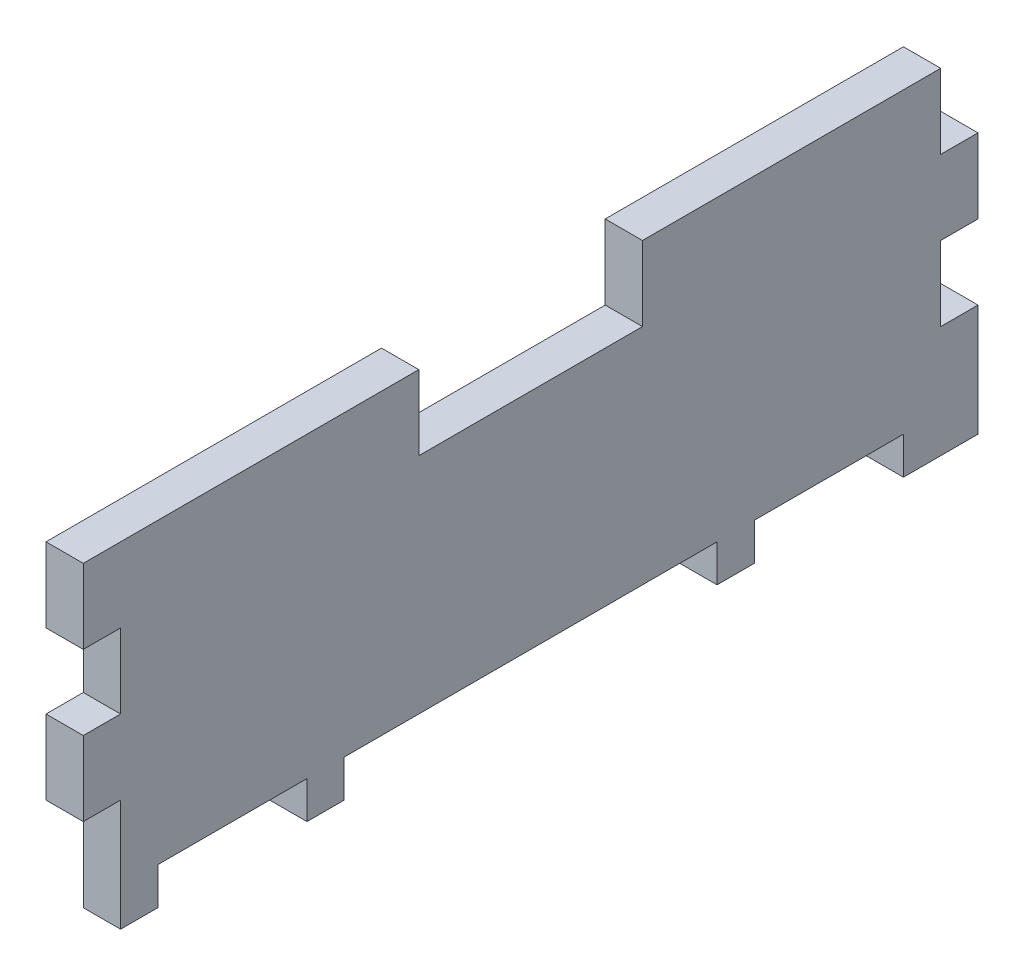
ISO-10303-21;
HEADER;
FILE_DESCRIPTION(('STEP AP214'),'2;1');
FILE_NAME('part.step','',(''),(''),'','','');
FILE_SCHEMA(('AUTOMOTIVE_DESIGN { 1 0 10303 214 1 1 1 1 }'));
ENDSEC;
DATA;
#1=APPLICATION_CONTEXT('core data for automotive mechanical design processes');
#2=APPLICATION_PROTOCOL_DEFINITION('international standard','automotive_design',2000,#1);
#3=PRODUCT_CONTEXT('',#1,'mechanical');
#4=PRODUCT('Part','Part','',(#3));
#5=PRODUCT_RELATED_PRODUCT_CATEGORY('part','',(#4));
#6=PRODUCT_DEFINITION_FORMATION('','',#4);
#7=PRODUCT_DEFINITION_CONTEXT('part definition',#1,'design');
#8=PRODUCT_DEFINITION('design','',#6,#7);
#9=PRODUCT_DEFINITION_SHAPE('','',#8);
#10=(LENGTH_UNIT() NAMED_UNIT(*) SI_UNIT(.MILLI.,.METRE.));
#11=(NAMED_UNIT(*) PLANE_ANGLE_UNIT() SI_UNIT($,.RADIAN.));
#12=(NAMED_UNIT(*) SI_UNIT($,.STERADIAN.) SOLID_ANGLE_UNIT());
#13=UNCERTAINTY_MEASURE_WITH_UNIT(LENGTH_MEASURE(1.E-05),#10,'distance_accuracy_value','');
#14=(GEOMETRIC_REPRESENTATION_CONTEXT(3) GLOBAL_UNCERTAINTY_ASSIGNED_CONTEXT((#13)) GLOBAL_UNIT_ASSIGNED_CONTEXT((#10,
#11,#12)) REPRESENTATION_CONTEXT('',''));
#15=CARTESIAN_POINT('',(0.,0.,0.));
#16=DIRECTION('',(0.,0.,1.));
#17=DIRECTION('',(1.,0.,0.));
#18=AXIS2_PLACEMENT_3D('',#15,#16,#17);
#19=CARTESIAN_POINT('',(6.35,25.4,0.));
#20=DIRECTION('',(0.,1.,0.));
#21=DIRECTION('',(0.,0.,1.));
#22=AXIS2_PLACEMENT_3D('',#19,#20,#21);
#23=PLANE('',#22);
#24=DIRECTION('',(0.,0.,-1.));
#25=VECTOR('',#24,1.);
#26=CARTESIAN_POINT('',(0.,25.4,0.));
#27=LINE('',#26,#25);
#28=CARTESIAN_POINT('',(0.,25.4,-19.05));
#29=VERTEX_POINT('',#28);
#30=CARTESIAN_POINT('',(0.,25.4,-69.85));
#31=VERTEX_POINT('',#30);
#32=EDGE_CURVE('E274',#29,#31,#27,.T.);
#33=ORIENTED_EDGE('',*,*,#32,.F.);
#34=DIRECTION('',(-1.,0.,0.));
#35=VECTOR('',#34,1.);
#36=CARTESIAN_POINT('',(6.35,25.4,-19.05));
#37=LINE('',#36,#35);
#38=CARTESIAN_POINT('',(6.35,25.4,-19.05));
#39=VERTEX_POINT('',#38);
#40=EDGE_CURVE('E11',#39,#29,#37,.T.);
#41=ORIENTED_EDGE('',*,*,#40,.F.);
#42=DIRECTION('',(0.,0.,-1.));
#43=VECTOR('',#42,1.);
#44=CARTESIAN_POINT('',(6.35,25.4,0.));
#45=LINE('',#44,#43);
#46=CARTESIAN_POINT('',(6.35,25.4,-69.85));
#47=VERTEX_POINT('',#46);
#48=EDGE_CURVE('E436',#39,#47,#45,.T.);
#49=ORIENTED_EDGE('',*,*,#48,.T.);
#50=DIRECTION('',(-1.,0.,0.));
#51=VECTOR('',#50,1.);
#52=CARTESIAN_POINT('',(6.35,25.4,-69.85));
#53=LINE('',#52,#51);
#54=EDGE_CURVE('E52',#47,#31,#53,.T.);
#55=ORIENTED_EDGE('',*,*,#54,.T.);
#56=EDGE_LOOP('',(#33,#41,#49,#55));
#57=FACE_BOUND('',#56,.T.);
#58=ADVANCED_FACE('F35',(#57),#23,.T.);
#59=CARTESIAN_POINT('',(6.35,0.,-19.05));
#60=DIRECTION('',(0.,0.,-1.));
#61=DIRECTION('',(0.,1.,0.));
#62=AXIS2_PLACEMENT_3D('',#59,#60,#61);
#63=PLANE('',#62);
#64=DIRECTION('',(0.,-1.,0.));
#65=VECTOR('',#64,1.);
#66=CARTESIAN_POINT('',(0.,0.,-19.05));
#67=LINE('',#66,#65);
#68=CARTESIAN_POINT('',(0.,12.7,-19.05));
#69=VERTEX_POINT('',#68);
#70=EDGE_CURVE('E276',#29,#69,#67,.T.);
#71=ORIENTED_EDGE('',*,*,#70,.T.);
#72=DIRECTION('',(-1.,0.,0.));
#73=VECTOR('',#72,1.);
#74=CARTESIAN_POINT('',(6.35,12.7,-19.05));
#75=LINE('',#74,#73);
#76=CARTESIAN_POINT('',(6.35,12.7,-19.05));
#77=VERTEX_POINT('',#76);
#78=EDGE_CURVE('E44',#77,#69,#75,.T.);
#79=ORIENTED_EDGE('',*,*,#78,.F.);
#80=DIRECTION('',(0.,-1.,0.));
#81=VECTOR('',#80,1.);
#82=CARTESIAN_POINT('',(6.35,0.,-19.05));
#83=LINE('',#82,#81);
#84=EDGE_CURVE('E432',#39,#77,#83,.T.);
#85=ORIENTED_EDGE('',*,*,#84,.F.);
#86=ORIENTED_EDGE('',*,*,#40,.T.);
#87=EDGE_LOOP('',(#71,#79,#85,#86));
#88=FACE_BOUND('',#87,.T.);
#89=ADVANCED_FACE('F37',(#88),#63,.F.);
#90=CARTESIAN_POINT('',(6.35,12.7,0.));
#91=DIRECTION('',(0.,1.,0.));
#92=DIRECTION('',(0.,0.,1.));
#93=AXIS2_PLACEMENT_3D('',#90,#91,#92);
#94=PLANE('',#93);
#95=DIRECTION('',(0.,0.,-1.));
#96=VECTOR('',#95,1.);
#97=CARTESIAN_POINT('',(0.,12.7,0.));
#98=LINE('',#97,#96);
#99=CARTESIAN_POINT('',(0.,12.7,19.05));
#100=VERTEX_POINT('',#99);
#101=EDGE_CURVE('E281',#100,#69,#98,.T.);
#102=ORIENTED_EDGE('',*,*,#101,.F.);
#103=DIRECTION('',(-1.,0.,0.));
#104=VECTOR('',#103,1.);
#105=CARTESIAN_POINT('',(6.35,12.7,19.05));
#106=LINE('',#105,#104);
#107=CARTESIAN_POINT('',(6.35,12.7,19.05));
#108=VERTEX_POINT('',#107);
#109=EDGE_CURVE('E408',#108,#100,#106,.T.);
#110=ORIENTED_EDGE('',*,*,#109,.F.);
#111=DIRECTION('',(0.,0.,-1.));
#112=VECTOR('',#111,1.);
#113=CARTESIAN_POINT('',(6.35,12.7,0.));
#114=LINE('',#113,#112);
#115=EDGE_CURVE('E415',#108,#77,#114,.T.);
#116=ORIENTED_EDGE('',*,*,#115,.T.);
#117=ORIENTED_EDGE('',*,*,#78,.T.);
#118=EDGE_LOOP('',(#102,#110,#116,#117));
#119=FACE_BOUND('',#118,.T.);
#120=ADVANCED_FACE('F413',(#119),#94,.T.);
#121=CARTESIAN_POINT('',(6.35,0.,19.05));
#122=DIRECTION('',(0.,0.,-1.));
#123=DIRECTION('',(-1.,0.,0.));
#124=AXIS2_PLACEMENT_3D('',#121,#122,#123);
#125=PLANE('',#124);
#126=DIRECTION('',(0.,-1.,0.));
#127=VECTOR('',#126,1.);
#128=CARTESIAN_POINT('',(0.,0.,19.05));
#129=LINE('',#128,#127);
#130=CARTESIAN_POINT('',(0.,25.4,19.05));
#131=VERTEX_POINT('',#130);
#132=EDGE_CURVE('E284',#131,#100,#129,.T.);
#133=ORIENTED_EDGE('',*,*,#132,.F.);
#134=DIRECTION('',(-1.,0.,0.));
#135=VECTOR('',#134,1.);
#136=CARTESIAN_POINT('',(6.35,25.4,19.05));
#137=LINE('',#136,#135);
#138=CARTESIAN_POINT('',(6.35,25.4,19.05));
#139=VERTEX_POINT('',#138);
#140=EDGE_CURVE('E406',#139,#131,#137,.T.);
#141=ORIENTED_EDGE('',*,*,#140,.F.);
#142=DIRECTION('',(0.,-1.,0.));
#143=VECTOR('',#142,1.);
#144=CARTESIAN_POINT('',(6.35,0.,19.05));
#145=LINE('',#144,#143);
#146=EDGE_CURVE('E428',#139,#108,#145,.T.);
#147=ORIENTED_EDGE('',*,*,#146,.T.);
#148=ORIENTED_EDGE('',*,*,#109,.T.);
#149=EDGE_LOOP('',(#133,#141,#147,#148));
#150=FACE_BOUND('',#149,.T.);
#151=ADVANCED_FACE('F425',(#150),#125,.T.);
#152=CARTESIAN_POINT('',(0.,25.4,76.2));
#153=VERTEX_POINT('',#152);
#154=EDGE_CURVE('E278',#153,#131,#27,.T.);
#155=ORIENTED_EDGE('',*,*,#154,.F.);
#156=DIRECTION('',(-1.,0.,0.));
#157=VECTOR('',#156,1.);
#158=CARTESIAN_POINT('',(6.35,25.4,76.2));
#159=LINE('',#158,#157);
#160=CARTESIAN_POINT('',(6.35,25.4,76.2));
#161=VERTEX_POINT('',#160);
#162=EDGE_CURVE('E404',#161,#153,#159,.T.);
#163=ORIENTED_EDGE('',*,*,#162,.F.);
#164=EDGE_CURVE('E434',#161,#139,#45,.T.);
#165=ORIENTED_EDGE('',*,*,#164,.T.);
#166=ORIENTED_EDGE('',*,*,#140,.T.);
#167=EDGE_LOOP('',(#155,#163,#165,#166));
#168=FACE_BOUND('',#167,.T.);
#169=ADVANCED_FACE('F512',(#168),#23,.T.);
#170=CARTESIAN_POINT('',(6.35,0.,76.2));
#171=DIRECTION('',(0.,0.,1.));
#172=DIRECTION('',(1.,0.,0.));
#173=AXIS2_PLACEMENT_3D('',#170,#171,#172);
#174=PLANE('',#173);
#175=DIRECTION('',(0.,1.,0.));
#176=VECTOR('',#175,1.);
#177=CARTESIAN_POINT('',(0.,0.,76.2));
#178=LINE('',#177,#176);
#179=CARTESIAN_POINT('',(0.,12.7,76.2));
#180=VERTEX_POINT('',#179);
#181=EDGE_CURVE('E287',#180,#153,#178,.T.);
#182=ORIENTED_EDGE('',*,*,#181,.F.);
#183=DIRECTION('',(-1.,0.,0.));
#184=VECTOR('',#183,1.);
#185=CARTESIAN_POINT('',(6.35,12.7,76.2));
#186=LINE('',#185,#184);
#187=CARTESIAN_POINT('',(6.35,12.7,76.2));
#188=VERTEX_POINT('',#187);
#189=EDGE_CURVE('E402',#188,#180,#186,.T.);
#190=ORIENTED_EDGE('',*,*,#189,.F.);
#191=DIRECTION('',(0.,1.,0.));
#192=VECTOR('',#191,1.);
#193=CARTESIAN_POINT('',(6.35,0.,76.2));
#194=LINE('',#193,#192);
#195=EDGE_CURVE('E440',#188,#161,#194,.T.);
#196=ORIENTED_EDGE('',*,*,#195,.T.);
#197=ORIENTED_EDGE('',*,*,#162,.T.);
#198=EDGE_LOOP('',(#182,#190,#196,#197));
#199=FACE_BOUND('',#198,.T.);
#200=ADVANCED_FACE('F519',(#199),#174,.T.);
#201=CARTESIAN_POINT('',(6.35,12.7,0.));
#202=DIRECTION('',(0.,1.,0.));
#203=DIRECTION('',(0.,0.,1.));
#204=AXIS2_PLACEMENT_3D('',#201,#202,#203);
#205=PLANE('',#204);
#206=DIRECTION('',(0.,0.,-1.));
#207=VECTOR('',#206,1.);
#208=CARTESIAN_POINT('',(0.,12.7,0.));
#209=LINE('',#208,#207);
#210=CARTESIAN_POINT('',(0.,12.7,69.85));
#211=VERTEX_POINT('',#210);
#212=EDGE_CURVE('E290',#180,#211,#209,.T.);
#213=ORIENTED_EDGE('',*,*,#212,.T.);
#214=DIRECTION('',(-1.,0.,0.));
#215=VECTOR('',#214,1.);
#216=CARTESIAN_POINT('',(6.35,12.7,69.85));
#217=LINE('',#216,#215);
#218=CARTESIAN_POINT('',(6.35,12.7,69.85));
#219=VERTEX_POINT('',#218);
#220=EDGE_CURVE('E399',#219,#211,#217,.T.);
#221=ORIENTED_EDGE('',*,*,#220,.F.);
#222=DIRECTION('',(0.,0.,-1.));
#223=VECTOR('',#222,1.);
#224=CARTESIAN_POINT('',(6.35,12.7,0.));
#225=LINE('',#224,#223);
#226=EDGE_CURVE('E443',#188,#219,#225,.T.);
#227=ORIENTED_EDGE('',*,*,#226,.F.);
#228=ORIENTED_EDGE('',*,*,#189,.T.);
#229=EDGE_LOOP('',(#213,#221,#227,#228));
#230=FACE_BOUND('',#229,.T.);
#231=ADVANCED_FACE('F525',(#230),#205,.F.);
#232=CARTESIAN_POINT('',(6.35,0.,69.85));
#233=DIRECTION('',(0.,0.,-1.));
#234=DIRECTION('',(-1.,0.,0.));
#235=AXIS2_PLACEMENT_3D('',#232,#233,#234);
#236=PLANE('',#235);
#237=DIRECTION('',(0.,-1.,0.));
#238=VECTOR('',#237,1.);
#239=CARTESIAN_POINT('',(0.,0.,69.85));
#240=LINE('',#239,#238);
#241=CARTESIAN_POINT('',(0.,0.,69.85));
#242=VERTEX_POINT('',#241);
#243=EDGE_CURVE('E293',#211,#242,#240,.T.);
#244=ORIENTED_EDGE('',*,*,#243,.T.);
#245=DIRECTION('',(-1.,0.,0.));
#246=VECTOR('',#245,1.);
#247=CARTESIAN_POINT('',(6.35,0.,69.85));
#248=LINE('',#247,#246);
#249=CARTESIAN_POINT('',(6.35,0.,69.85));
#250=VERTEX_POINT('',#249);
#251=EDGE_CURVE('E396',#250,#242,#248,.T.);
#252=ORIENTED_EDGE('',*,*,#251,.F.);
#253=DIRECTION('',(0.,-1.,0.));
#254=VECTOR('',#253,1.);
#255=CARTESIAN_POINT('',(6.35,0.,69.85));
#256=LINE('',#255,#254);
#257=EDGE_CURVE('E446',#219,#250,#256,.T.);
#258=ORIENTED_EDGE('',*,*,#257,.F.);
#259=ORIENTED_EDGE('',*,*,#220,.T.);
#260=EDGE_LOOP('',(#244,#252,#258,#259));
#261=FACE_BOUND('',#260,.T.);
#262=ADVANCED_FACE('F779',(#261),#236,.F.);
#263=CARTESIAN_POINT('',(6.35,0.,0.));
#264=DIRECTION('',(0.,-1.,0.));
#265=DIRECTION('',(0.,0.,-1.));
#266=AXIS2_PLACEMENT_3D('',#263,#264,#265);
#267=PLANE('',#266);
#268=DIRECTION('',(0.,0.,1.));
#269=VECTOR('',#268,1.);
#270=CARTESIAN_POINT('',(0.,0.,0.));
#271=LINE('',#270,#269);
#272=CARTESIAN_POINT('',(0.,0.,76.2));
#273=VERTEX_POINT('',#272);
#274=EDGE_CURVE('E295',#242,#273,#271,.T.);
#275=ORIENTED_EDGE('',*,*,#274,.T.);
#276=DIRECTION('',(-1.,0.,0.));
#277=VECTOR('',#276,1.);
#278=CARTESIAN_POINT('',(6.35,0.,76.2));
#279=LINE('',#278,#277);
#280=CARTESIAN_POINT('',(6.35,0.,76.2));
#281=VERTEX_POINT('',#280);
#282=EDGE_CURVE('E394',#281,#273,#279,.T.);
#283=ORIENTED_EDGE('',*,*,#282,.F.);
#284=DIRECTION('',(0.,0.,1.));
#285=VECTOR('',#284,1.);
#286=CARTESIAN_POINT('',(6.35,0.,0.));
#287=LINE('',#286,#285);
#288=EDGE_CURVE('E448',#250,#281,#287,.T.);
#289=ORIENTED_EDGE('',*,*,#288,.F.);
#290=ORIENTED_EDGE('',*,*,#251,.T.);
#291=EDGE_LOOP('',(#275,#283,#289,#290));
#292=FACE_BOUND('',#291,.T.);
#293=ADVANCED_FACE('F769',(#292),#267,.F.);
#294=CARTESIAN_POINT('',(0.,-12.7,76.2));
#295=VERTEX_POINT('',#294);
#296=EDGE_CURVE('E291',#295,#273,#178,.T.);
#297=ORIENTED_EDGE('',*,*,#296,.F.);
#298=DIRECTION('',(-1.,0.,0.));
#299=VECTOR('',#298,1.);
#300=CARTESIAN_POINT('',(6.35,-12.7,76.2));
#301=LINE('',#300,#299);
#302=CARTESIAN_POINT('',(6.35,-12.7,76.2));
#303=VERTEX_POINT('',#302);
#304=EDGE_CURVE('E392',#303,#295,#301,.T.);
#305=ORIENTED_EDGE('',*,*,#304,.F.);
#306=EDGE_CURVE('E444',#303,#281,#194,.T.);
#307=ORIENTED_EDGE('',*,*,#306,.T.);
#308=ORIENTED_EDGE('',*,*,#282,.T.);
#309=EDGE_LOOP('',(#297,#305,#307,#308));
#310=FACE_BOUND('',#309,.T.);
#311=ADVANCED_FACE('F528',(#310),#174,.T.);
#312=CARTESIAN_POINT('',(6.35,-12.7,0.));
#313=DIRECTION('',(0.,1.,0.));
#314=DIRECTION('',(0.,0.,1.));
#315=AXIS2_PLACEMENT_3D('',#312,#313,#314);
#316=PLANE('',#315);
#317=DIRECTION('',(0.,0.,-1.));
#318=VECTOR('',#317,1.);
#319=CARTESIAN_POINT('',(0.,-12.7,0.));
#320=LINE('',#319,#318);
#321=CARTESIAN_POINT('',(0.,-12.7,69.85));
#322=VERTEX_POINT('',#321);
#323=EDGE_CURVE('E298',#295,#322,#320,.T.);
#324=ORIENTED_EDGE('',*,*,#323,.T.);
#325=DIRECTION('',(-1.,0.,0.));
#326=VECTOR('',#325,1.);
#327=CARTESIAN_POINT('',(6.35,-12.7,69.85));
#328=LINE('',#327,#326);
#329=CARTESIAN_POINT('',(6.35,-12.7,69.85));
#330=VERTEX_POINT('',#329);
#331=EDGE_CURVE('E389',#330,#322,#328,.T.);
#332=ORIENTED_EDGE('',*,*,#331,.F.);
#333=DIRECTION('',(0.,0.,-1.));
#334=VECTOR('',#333,1.);
#335=CARTESIAN_POINT('',(6.35,-12.7,0.));
#336=LINE('',#335,#334);
#337=EDGE_CURVE('E450',#303,#330,#336,.T.);
#338=ORIENTED_EDGE('',*,*,#337,.F.);
#339=ORIENTED_EDGE('',*,*,#304,.T.);
#340=EDGE_LOOP('',(#324,#332,#338,#339));
#341=FACE_BOUND('',#340,.T.);
#342=ADVANCED_FACE('F748',(#341),#316,.F.);
#343=CARTESIAN_POINT('',(6.35,0.,69.85));
#344=DIRECTION('',(0.,0.,-1.));
#345=DIRECTION('',(0.,1.,0.));
#346=AXIS2_PLACEMENT_3D('',#343,#344,#345);
#347=PLANE('',#346);
#348=DIRECTION('',(0.,-1.,0.));
#349=VECTOR('',#348,1.);
#350=CARTESIAN_POINT('',(0.,0.,69.85));
#351=LINE('',#350,#349);
#352=CARTESIAN_POINT('',(0.,-31.75,69.85));
#353=VERTEX_POINT('',#352);
#354=EDGE_CURVE('E300',#322,#353,#351,.T.);
#355=ORIENTED_EDGE('',*,*,#354,.T.);
#356=DIRECTION('',(-1.,0.,0.));
#357=VECTOR('',#356,1.);
#358=CARTESIAN_POINT('',(6.35,-31.75,69.85));
#359=LINE('',#358,#357);
#360=CARTESIAN_POINT('',(6.35,-31.75,69.85));
#361=VERTEX_POINT('',#360);
#362=EDGE_CURVE('E386',#361,#353,#359,.T.);
#363=ORIENTED_EDGE('',*,*,#362,.F.);
#364=DIRECTION('',(0.,-1.,0.));
#365=VECTOR('',#364,1.);
#366=CARTESIAN_POINT('',(6.35,0.,69.85));
#367=LINE('',#366,#365);
#368=EDGE_CURVE('E452',#330,#361,#367,.T.);
#369=ORIENTED_EDGE('',*,*,#368,.F.);
#370=ORIENTED_EDGE('',*,*,#331,.T.);
#371=EDGE_LOOP('',(#355,#363,#369,#370));
#372=FACE_BOUND('',#371,.T.);
#373=ADVANCED_FACE('F738',(#372),#347,.F.);
#374=CARTESIAN_POINT('',(6.35,-31.75,0.));
#375=DIRECTION('',(0.,1.,0.));
#376=DIRECTION('',(0.,0.,1.));
#377=AXIS2_PLACEMENT_3D('',#374,#375,#376);
#378=PLANE('',#377);
#379=DIRECTION('',(0.,0.,-1.));
#380=VECTOR('',#379,1.);
#381=CARTESIAN_POINT('',(0.,-31.75,0.));
#382=LINE('',#381,#380);
#383=CARTESIAN_POINT('',(0.,-31.75,63.5));
#384=VERTEX_POINT('',#383);
#385=EDGE_CURVE('E302',#353,#384,#382,.T.);
#386=ORIENTED_EDGE('',*,*,#385,.T.);
#387=DIRECTION('',(-1.,0.,0.));
#388=VECTOR('',#387,1.);
#389=CARTESIAN_POINT('',(6.35,-31.75,63.5));
#390=LINE('',#389,#388);
#391=CARTESIAN_POINT('',(6.35,-31.75,63.5));
#392=VERTEX_POINT('',#391);
#393=EDGE_CURVE('E384',#392,#384,#390,.T.);
#394=ORIENTED_EDGE('',*,*,#393,.F.);
#395=DIRECTION('',(0.,0.,-1.));
#396=VECTOR('',#395,1.);
#397=CARTESIAN_POINT('',(6.35,-31.75,0.));
#398=LINE('',#397,#396);
#399=EDGE_CURVE('E454',#361,#392,#398,.T.);
#400=ORIENTED_EDGE('',*,*,#399,.F.);
#401=ORIENTED_EDGE('',*,*,#362,.T.);
#402=EDGE_LOOP('',(#386,#394,#400,#401));
#403=FACE_BOUND('',#402,.T.);
#404=ADVANCED_FACE('F727',(#403),#378,.F.);
#405=CARTESIAN_POINT('',(6.35,0.,63.5));
#406=DIRECTION('',(0.,0.,-1.));
#407=DIRECTION('',(-1.,0.,0.));
#408=AXIS2_PLACEMENT_3D('',#405,#406,#407);
#409=PLANE('',#408);
#410=DIRECTION('',(0.,-1.,0.));
#411=VECTOR('',#410,1.);
#412=CARTESIAN_POINT('',(0.,0.,63.5));
#413=LINE('',#412,#411);
#414=CARTESIAN_POINT('',(0.,-25.4,63.5));
#415=VERTEX_POINT('',#414);
#416=EDGE_CURVE('E305',#415,#384,#413,.T.);
#417=ORIENTED_EDGE('',*,*,#416,.F.);
#418=DIRECTION('',(-1.,0.,0.));
#419=VECTOR('',#418,1.);
#420=CARTESIAN_POINT('',(6.35,-25.4,63.5));
#421=LINE('',#420,#419);
#422=CARTESIAN_POINT('',(6.35,-25.4,63.5));
#423=VERTEX_POINT('',#422);
#424=EDGE_CURVE('E382',#423,#415,#421,.T.);
#425=ORIENTED_EDGE('',*,*,#424,.F.);
#426=DIRECTION('',(0.,-1.,0.));
#427=VECTOR('',#426,1.);
#428=CARTESIAN_POINT('',(6.35,0.,63.5));
#429=LINE('',#428,#427);
#430=EDGE_CURVE('E456',#423,#392,#429,.T.);
#431=ORIENTED_EDGE('',*,*,#430,.T.);
#432=ORIENTED_EDGE('',*,*,#393,.T.);
#433=EDGE_LOOP('',(#417,#425,#431,#432));
#434=FACE_BOUND('',#433,.T.);
#435=ADVANCED_FACE('F717',(#434),#409,.T.);
#436=CARTESIAN_POINT('',(6.35,-25.4,0.));
#437=DIRECTION('',(0.,1.,0.));
#438=DIRECTION('',(0.,0.,1.));
#439=AXIS2_PLACEMENT_3D('',#436,#437,#438);
#440=PLANE('',#439);
#441=DIRECTION('',(0.,0.,-1.));
#442=VECTOR('',#441,1.);
#443=CARTESIAN_POINT('',(0.,-25.4,0.));
#444=LINE('',#443,#442);
#445=CARTESIAN_POINT('',(0.,-25.4,38.1));
#446=VERTEX_POINT('',#445);
#447=EDGE_CURVE('E308',#415,#446,#444,.T.);
#448=ORIENTED_EDGE('',*,*,#447,.T.);
#449=DIRECTION('',(-1.,0.,0.));
#450=VECTOR('',#449,1.);
#451=CARTESIAN_POINT('',(6.35,-25.4,38.1));
#452=LINE('',#451,#450);
#453=CARTESIAN_POINT('',(6.35,-25.4,38.1));
#454=VERTEX_POINT('',#453);
#455=EDGE_CURVE('E379',#454,#446,#452,.T.);
#456=ORIENTED_EDGE('',*,*,#455,.F.);
#457=DIRECTION('',(0.,0.,-1.));
#458=VECTOR('',#457,1.);
#459=CARTESIAN_POINT('',(6.35,-25.4,0.));
#460=LINE('',#459,#458);
#461=EDGE_CURVE('E459',#423,#454,#460,.T.);
#462=ORIENTED_EDGE('',*,*,#461,.F.);
#463=ORIENTED_EDGE('',*,*,#424,.T.);
#464=EDGE_LOOP('',(#448,#456,#462,#463));
#465=FACE_BOUND('',#464,.T.);
#466=ADVANCED_FACE('F637',(#465),#440,.F.);
#467=CARTESIAN_POINT('',(6.35,0.,38.1));
#468=DIRECTION('',(0.,0.,-1.));
#469=DIRECTION('',(0.,1.,0.));
#470=AXIS2_PLACEMENT_3D('',#467,#468,#469);
#471=PLANE('',#470);
#472=DIRECTION('',(0.,-1.,0.));
#473=VECTOR('',#472,1.);
#474=CARTESIAN_POINT('',(0.,0.,38.1));
#475=LINE('',#474,#473);
#476=CARTESIAN_POINT('',(0.,-31.7499999999999,38.1));
#477=VERTEX_POINT('',#476);
#478=EDGE_CURVE('E310',#446,#477,#475,.T.);
#479=ORIENTED_EDGE('',*,*,#478,.T.);
#480=DIRECTION('',(-1.,0.,0.));
#481=VECTOR('',#480,1.);
#482=CARTESIAN_POINT('',(6.35,-31.7499999999999,38.1));
#483=LINE('',#482,#481);
#484=CARTESIAN_POINT('',(6.35,-31.7499999999999,38.1));
#485=VERTEX_POINT('',#484);
#486=EDGE_CURVE('E376',#485,#477,#483,.T.);
#487=ORIENTED_EDGE('',*,*,#486,.F.);
#488=DIRECTION('',(0.,-1.,0.));
#489=VECTOR('',#488,1.);
#490=CARTESIAN_POINT('',(6.35,0.,38.1));
#491=LINE('',#490,#489);
#492=EDGE_CURVE('E461',#454,#485,#491,.T.);
#493=ORIENTED_EDGE('',*,*,#492,.F.);
#494=ORIENTED_EDGE('',*,*,#455,.T.);
#495=EDGE_LOOP('',(#479,#487,#493,#494));
#496=FACE_BOUND('',#495,.T.);
#497=ADVANCED_FACE('F698',(#496),#471,.F.);
#498=CARTESIAN_POINT('',(6.35,-31.7499999999999,0.));
#499=DIRECTION('',(0.,1.,0.));
#500=DIRECTION('',(0.,0.,1.));
#501=AXIS2_PLACEMENT_3D('',#498,#499,#500);
#502=PLANE('',#501);
#503=DIRECTION('',(0.,0.,-1.));
#504=VECTOR('',#503,1.);
#505=CARTESIAN_POINT('',(0.,-31.7499999999999,0.));
#506=LINE('',#505,#504);
#507=CARTESIAN_POINT('',(0.,-31.7499999999999,31.75));
#508=VERTEX_POINT('',#507);
#509=EDGE_CURVE('E314',#477,#508,#506,.T.);
#510=ORIENTED_EDGE('',*,*,#509,.T.);
#511=DIRECTION('',(-1.,0.,0.));
#512=VECTOR('',#511,1.);
#513=CARTESIAN_POINT('',(6.35,-31.7499999999999,31.75));
#514=LINE('',#513,#512);
#515=CARTESIAN_POINT('',(6.35,-31.7499999999999,31.75));
#516=VERTEX_POINT('',#515);
#517=EDGE_CURVE('E373',#516,#508,#514,.T.);
#518=ORIENTED_EDGE('',*,*,#517,.F.);
#519=DIRECTION('',(0.,0.,-1.));
#520=VECTOR('',#519,1.);
#521=CARTESIAN_POINT('',(6.35,-31.7499999999999,0.));
#522=LINE('',#521,#520);
#523=EDGE_CURVE('E465',#485,#516,#522,.T.);
#524=ORIENTED_EDGE('',*,*,#523,.F.);
#525=ORIENTED_EDGE('',*,*,#486,.T.);
#526=EDGE_LOOP('',(#510,#518,#524,#525));
#527=FACE_BOUND('',#526,.T.);
#528=ADVANCED_FACE('F687',(#527),#502,.F.);
#529=CARTESIAN_POINT('',(6.35,0.,31.75));
#530=DIRECTION('',(0.,0.,1.));
#531=DIRECTION('',(1.,0.,0.));
#532=AXIS2_PLACEMENT_3D('',#529,#530,#531);
#533=PLANE('',#532);
#534=DIRECTION('',(0.,1.,0.));
#535=VECTOR('',#534,1.);
#536=CARTESIAN_POINT('',(0.,0.,31.75));
#537=LINE('',#536,#535);
#538=CARTESIAN_POINT('',(0.,-25.4,31.75));
#539=VERTEX_POINT('',#538);
#540=EDGE_CURVE('E316',#508,#539,#537,.T.);
#541=ORIENTED_EDGE('',*,*,#540,.T.);
#542=DIRECTION('',(-1.,0.,0.));
#543=VECTOR('',#542,1.);
#544=CARTESIAN_POINT('',(6.35,-25.4,31.75));
#545=LINE('',#544,#543);
#546=CARTESIAN_POINT('',(6.35,-25.4,31.75));
#547=VERTEX_POINT('',#546);
#548=EDGE_CURVE('E370',#547,#539,#545,.T.);
#549=ORIENTED_EDGE('',*,*,#548,.F.);
#550=DIRECTION('',(0.,1.,0.));
#551=VECTOR('',#550,1.);
#552=CARTESIAN_POINT('',(6.35,0.,31.75));
#553=LINE('',#552,#551);
#554=EDGE_CURVE('E467',#516,#547,#553,.T.);
#555=ORIENTED_EDGE('',*,*,#554,.F.);
#556=ORIENTED_EDGE('',*,*,#517,.T.);
#557=EDGE_LOOP('',(#541,#549,#555,#556));
#558=FACE_BOUND('',#557,.T.);
#559=ADVANCED_FACE('F677',(#558),#533,.F.);
#560=CARTESIAN_POINT('',(0.,-25.4,-31.75));
#561=VERTEX_POINT('',#560);
#562=EDGE_CURVE('E312',#539,#561,#444,.T.);
#563=ORIENTED_EDGE('',*,*,#562,.T.);
#564=DIRECTION('',(-1.,0.,0.));
#565=VECTOR('',#564,1.);
#566=CARTESIAN_POINT('',(6.35,-25.4,-31.75));
#567=LINE('',#566,#565);
#568=CARTESIAN_POINT('',(6.35,-25.4,-31.75));
#569=VERTEX_POINT('',#568);
#570=EDGE_CURVE('E368',#569,#561,#567,.T.);
#571=ORIENTED_EDGE('',*,*,#570,.F.);
#572=EDGE_CURVE('E463',#547,#569,#460,.T.);
#573=ORIENTED_EDGE('',*,*,#572,.F.);
#574=ORIENTED_EDGE('',*,*,#548,.T.);
#575=EDGE_LOOP('',(#563,#571,#573,#574));
#576=FACE_BOUND('',#575,.T.);
#577=ADVANCED_FACE('F638',(#576),#440,.F.);
#578=CARTESIAN_POINT('',(6.35,0.,-31.75));
#579=DIRECTION('',(0.,0.,1.));
#580=DIRECTION('',(1.,0.,0.));
#581=AXIS2_PLACEMENT_3D('',#578,#579,#580);
#582=PLANE('',#581);
#583=DIRECTION('',(0.,1.,0.));
#584=VECTOR('',#583,1.);
#585=CARTESIAN_POINT('',(0.,0.,-31.75));
#586=LINE('',#585,#584);
#587=CARTESIAN_POINT('',(0.,-31.7499999999999,-31.75));
#588=VERTEX_POINT('',#587);
#589=EDGE_CURVE('E318',#588,#561,#586,.T.);
#590=ORIENTED_EDGE('',*,*,#589,.F.);
#591=DIRECTION('',(-1.,0.,0.));
#592=VECTOR('',#591,1.);
#593=CARTESIAN_POINT('',(6.35,-31.7499999999999,-31.75));
#594=LINE('',#593,#592);
#595=CARTESIAN_POINT('',(6.35,-31.7499999999999,-31.75));
#596=VERTEX_POINT('',#595);
#597=EDGE_CURVE('E366',#596,#588,#594,.T.);
#598=ORIENTED_EDGE('',*,*,#597,.F.);
#599=DIRECTION('',(0.,1.,0.));
#600=VECTOR('',#599,1.);
#601=CARTESIAN_POINT('',(6.35,0.,-31.75));
#602=LINE('',#601,#600);
#603=EDGE_CURVE('E469',#596,#569,#602,.T.);
#604=ORIENTED_EDGE('',*,*,#603,.T.);
#605=ORIENTED_EDGE('',*,*,#570,.T.);
#606=EDGE_LOOP('',(#590,#598,#604,#605));
#607=FACE_BOUND('',#606,.T.);
#608=ADVANCED_FACE('F658',(#607),#582,.T.);
#609=CARTESIAN_POINT('',(6.35,-31.7499999999999,0.));
#610=DIRECTION('',(0.,-1.,0.));
#611=DIRECTION('',(0.,0.,-1.));
#612=AXIS2_PLACEMENT_3D('',#609,#610,#611);
#613=PLANE('',#612);
#614=DIRECTION('',(0.,0.,1.));
#615=VECTOR('',#614,1.);
#616=CARTESIAN_POINT('',(0.,-31.7499999999999,0.));
#617=LINE('',#616,#615);
#618=CARTESIAN_POINT('',(0.,-31.7499999999999,-38.1));
#619=VERTEX_POINT('',#618);
#620=EDGE_CURVE('E321',#619,#588,#617,.T.);
#621=ORIENTED_EDGE('',*,*,#620,.F.);
#622=DIRECTION('',(-1.,0.,0.));
#623=VECTOR('',#622,1.);
#624=CARTESIAN_POINT('',(6.35,-31.7499999999999,-38.1));
#625=LINE('',#624,#623);
#626=CARTESIAN_POINT('',(6.35,-31.7499999999999,-38.1));
#627=VERTEX_POINT('',#626);
#628=EDGE_CURVE('E364',#627,#619,#625,.T.);
#629=ORIENTED_EDGE('',*,*,#628,.F.);
#630=DIRECTION('',(0.,0.,1.));
#631=VECTOR('',#630,1.);
#632=CARTESIAN_POINT('',(6.35,-31.7499999999999,0.));
#633=LINE('',#632,#631);
#634=EDGE_CURVE('E472',#627,#596,#633,.T.);
#635=ORIENTED_EDGE('',*,*,#634,.T.);
#636=ORIENTED_EDGE('',*,*,#597,.T.);
#637=EDGE_LOOP('',(#621,#629,#635,#636));
#638=FACE_BOUND('',#637,.T.);
#639=ADVANCED_FACE('F647',(#638),#613,.T.);
#640=CARTESIAN_POINT('',(6.35,0.,-38.1));
#641=DIRECTION('',(0.,0.,-1.));
#642=DIRECTION('',(0.,1.,0.));
#643=AXIS2_PLACEMENT_3D('',#640,#641,#642);
#644=PLANE('',#643);
#645=DIRECTION('',(0.,-1.,0.));
#646=VECTOR('',#645,1.);
#647=CARTESIAN_POINT('',(0.,0.,-38.1));
#648=LINE('',#647,#646);
#649=CARTESIAN_POINT('',(0.,-25.4,-38.1));
#650=VERTEX_POINT('',#649);
#651=EDGE_CURVE('E324',#650,#619,#648,.T.);
#652=ORIENTED_EDGE('',*,*,#651,.F.);
#653=DIRECTION('',(-1.,0.,0.));
#654=VECTOR('',#653,1.);
#655=CARTESIAN_POINT('',(6.35,-25.4,-38.1));
#656=LINE('',#655,#654);
#657=CARTESIAN_POINT('',(6.35,-25.4,-38.1));
#658=VERTEX_POINT('',#657);
#659=EDGE_CURVE('E362',#658,#650,#656,.T.);
#660=ORIENTED_EDGE('',*,*,#659,.F.);
#661=DIRECTION('',(0.,-1.,0.));
#662=VECTOR('',#661,1.);
#663=CARTESIAN_POINT('',(6.35,0.,-38.1));
#664=LINE('',#663,#662);
#665=EDGE_CURVE('E475',#658,#627,#664,.T.);
#666=ORIENTED_EDGE('',*,*,#665,.T.);
#667=ORIENTED_EDGE('',*,*,#628,.T.);
#668=EDGE_LOOP('',(#652,#660,#666,#667));
#669=FACE_BOUND('',#668,.T.);
#670=ADVANCED_FACE('F634',(#669),#644,.T.);
#671=CARTESIAN_POINT('',(0.,-25.4,-63.5));
#672=VERTEX_POINT('',#671);
#673=EDGE_CURVE('E311',#650,#672,#444,.T.);
#674=ORIENTED_EDGE('',*,*,#673,.T.);
#675=DIRECTION('',(-1.,0.,0.));
#676=VECTOR('',#675,1.);
#677=CARTESIAN_POINT('',(6.35,-25.4,-63.5));
#678=LINE('',#677,#676);
#679=CARTESIAN_POINT('',(6.35,-25.4,-63.5));
#680=VERTEX_POINT('',#679);
#681=EDGE_CURVE('E359',#680,#672,#678,.T.);
#682=ORIENTED_EDGE('',*,*,#681,.F.);
#683=EDGE_CURVE('E462',#658,#680,#460,.T.);
#684=ORIENTED_EDGE('',*,*,#683,.F.);
#685=ORIENTED_EDGE('',*,*,#659,.T.);
#686=EDGE_LOOP('',(#674,#682,#684,#685));
#687=FACE_BOUND('',#686,.T.);
#688=ADVANCED_FACE('F624',(#687),#440,.F.);
#689=CARTESIAN_POINT('',(6.35,2.77555756156289E-13,-63.4999999999999));
#690=DIRECTION('',(0.,0.,-1.));
#691=DIRECTION('',(0.,1.,0.));
#692=AXIS2_PLACEMENT_3D('',#689,#690,#691);
#693=PLANE('',#692);
#694=DIRECTION('',(0.,-1.,0.));
#695=VECTOR('',#694,1.);
#696=CARTESIAN_POINT('',(0.,2.77555756156289E-13,-63.4999999999999));
#697=LINE('',#696,#695);
#698=CARTESIAN_POINT('',(0.,-31.75,-63.5));
#699=VERTEX_POINT('',#698);
#700=EDGE_CURVE('E327',#672,#699,#697,.T.);
#701=ORIENTED_EDGE('',*,*,#700,.T.);
#702=DIRECTION('',(-1.,0.,0.));
#703=VECTOR('',#702,1.);
#704=CARTESIAN_POINT('',(6.35,-31.75,-63.5));
#705=LINE('',#704,#703);
#706=CARTESIAN_POINT('',(6.35,-31.75,-63.5));
#707=VERTEX_POINT('',#706);
#708=EDGE_CURVE('E357',#707,#699,#705,.T.);
#709=ORIENTED_EDGE('',*,*,#708,.F.);
#710=DIRECTION('',(0.,-1.,0.));
#711=VECTOR('',#710,1.);
#712=CARTESIAN_POINT('',(6.35,2.77555756156289E-13,-63.4999999999999));
#713=LINE('',#712,#711);
#714=EDGE_CURVE('E478',#680,#707,#713,.T.);
#715=ORIENTED_EDGE('',*,*,#714,.F.);
#716=ORIENTED_EDGE('',*,*,#681,.T.);
#717=EDGE_LOOP('',(#701,#709,#715,#716));
#718=FACE_BOUND('',#717,.T.);
#719=ADVANCED_FACE('F574',(#718),#693,.F.);
#720=CARTESIAN_POINT('',(6.35,-31.75,0.));
#721=DIRECTION('',(0.,-1.,0.));
#722=DIRECTION('',(0.,0.,-1.));
#723=AXIS2_PLACEMENT_3D('',#720,#721,#722);
#724=PLANE('',#723);
#725=DIRECTION('',(0.,0.,1.));
#726=VECTOR('',#725,1.);
#727=CARTESIAN_POINT('',(0.,-31.75,0.));
#728=LINE('',#727,#726);
#729=CARTESIAN_POINT('',(0.,-31.75,-76.2));
#730=VERTEX_POINT('',#729);
#731=EDGE_CURVE('E330',#730,#699,#728,.T.);
#732=ORIENTED_EDGE('',*,*,#731,.F.);
#733=DIRECTION('',(-1.,0.,0.));
#734=VECTOR('',#733,1.);
#735=CARTESIAN_POINT('',(6.35,-31.75,-76.2));
#736=LINE('',#735,#734);
#737=CARTESIAN_POINT('',(6.35,-31.75,-76.2));
#738=VERTEX_POINT('',#737);
#739=EDGE_CURVE('E277',#738,#730,#736,.T.);
#740=ORIENTED_EDGE('',*,*,#739,.F.);
#741=DIRECTION('',(0.,0.,1.));
#742=VECTOR('',#741,1.);
#743=CARTESIAN_POINT('',(6.35,-31.75,0.));
#744=LINE('',#743,#742);
#745=EDGE_CURVE('E480',#738,#707,#744,.T.);
#746=ORIENTED_EDGE('',*,*,#745,.T.);
#747=ORIENTED_EDGE('',*,*,#708,.T.);
#748=EDGE_LOOP('',(#732,#740,#746,#747));
#749=FACE_BOUND('',#748,.T.);
#750=ADVANCED_FACE('F563',(#749),#724,.T.);
#751=CARTESIAN_POINT('',(6.35,0.,-76.2));
#752=DIRECTION('',(0.,0.,1.));
#753=DIRECTION('',(1.,0.,0.));
#754=AXIS2_PLACEMENT_3D('',#751,#752,#753);
#755=PLANE('',#754);
#756=DIRECTION('',(0.,1.,0.));
#757=VECTOR('',#756,1.);
#758=CARTESIAN_POINT('',(0.,0.,-76.2));
#759=LINE('',#758,#757);
#760=CARTESIAN_POINT('',(0.,-12.7,-76.2));
#761=VERTEX_POINT('',#760);
#762=EDGE_CURVE('E333',#730,#761,#759,.T.);
#763=ORIENTED_EDGE('',*,*,#762,.T.);
#764=DIRECTION('',(-1.,0.,0.));
#765=VECTOR('',#764,1.);
#766=CARTESIAN_POINT('',(6.35,-12.7,-76.2));
#767=LINE('',#766,#765);
#768=CARTESIAN_POINT('',(6.35,-12.7,-76.2));
#769=VERTEX_POINT('',#768);
#770=EDGE_CURVE('E354',#769,#761,#767,.T.);
#771=ORIENTED_EDGE('',*,*,#770,.F.);
#772=DIRECTION('',(0.,1.,0.));
#773=VECTOR('',#772,1.);
#774=CARTESIAN_POINT('',(6.35,0.,-76.2));
#775=LINE('',#774,#773);
#776=EDGE_CURVE('E483',#738,#769,#775,.T.);
#777=ORIENTED_EDGE('',*,*,#776,.F.);
#778=ORIENTED_EDGE('',*,*,#739,.T.);
#779=EDGE_LOOP('',(#763,#771,#777,#778));
#780=FACE_BOUND('',#779,.T.);
#781=ADVANCED_FACE('F559',(#780),#755,.F.);
#782=CARTESIAN_POINT('',(6.35,-12.7,0.));
#783=DIRECTION('',(0.,-1.,0.));
#784=DIRECTION('',(0.,0.,-1.));
#785=AXIS2_PLACEMENT_3D('',#782,#783,#784);
#786=PLANE('',#785);
#787=DIRECTION('',(0.,0.,1.));
#788=VECTOR('',#787,1.);
#789=CARTESIAN_POINT('',(0.,-12.7,0.));
#790=LINE('',#789,#788);
#791=CARTESIAN_POINT('',(0.,-12.7,-69.85));
#792=VERTEX_POINT('',#791);
#793=EDGE_CURVE('E335',#761,#792,#790,.T.);
#794=ORIENTED_EDGE('',*,*,#793,.T.);
#795=DIRECTION('',(-1.,0.,0.));
#796=VECTOR('',#795,1.);
#797=CARTESIAN_POINT('',(6.35,-12.7,-69.85));
#798=LINE('',#797,#796);
#799=CARTESIAN_POINT('',(6.35,-12.7,-69.85));
#800=VERTEX_POINT('',#799);
#801=EDGE_CURVE('E352',#800,#792,#798,.T.);
#802=ORIENTED_EDGE('',*,*,#801,.F.);
#803=DIRECTION('',(0.,0.,1.));
#804=VECTOR('',#803,1.);
#805=CARTESIAN_POINT('',(6.35,-12.7,0.));
#806=LINE('',#805,#804);
#807=EDGE_CURVE('E485',#769,#800,#806,.T.);
#808=ORIENTED_EDGE('',*,*,#807,.F.);
#809=ORIENTED_EDGE('',*,*,#770,.T.);
#810=EDGE_LOOP('',(#794,#802,#808,#809));
#811=FACE_BOUND('',#810,.T.);
#812=ADVANCED_FACE('F495',(#811),#786,.F.);
#813=CARTESIAN_POINT('',(6.35,0.,-69.85));
#814=DIRECTION('',(0.,0.,-1.));
#815=DIRECTION('',(0.,1.,0.));
#816=AXIS2_PLACEMENT_3D('',#813,#814,#815);
#817=PLANE('',#816);
#818=DIRECTION('',(0.,-1.,0.));
#819=VECTOR('',#818,1.);
#820=CARTESIAN_POINT('',(0.,0.,-69.85));
#821=LINE('',#820,#819);
#822=CARTESIAN_POINT('',(0.,0.,-69.85));
#823=VERTEX_POINT('',#822);
#824=EDGE_CURVE('E338',#823,#792,#821,.T.);
#825=ORIENTED_EDGE('',*,*,#824,.F.);
#826=DIRECTION('',(-1.,0.,0.));
#827=VECTOR('',#826,1.);
#828=CARTESIAN_POINT('',(6.35,0.,-69.85));
#829=LINE('',#828,#827);
#830=CARTESIAN_POINT('',(6.35,0.,-69.85));
#831=VERTEX_POINT('',#830);
#832=EDGE_CURVE('E350',#831,#823,#829,.T.);
#833=ORIENTED_EDGE('',*,*,#832,.F.);
#834=DIRECTION('',(0.,-1.,0.));
#835=VECTOR('',#834,1.);
#836=CARTESIAN_POINT('',(6.35,0.,-69.85));
#837=LINE('',#836,#835);
#838=EDGE_CURVE('E271',#831,#800,#837,.T.);
#839=ORIENTED_EDGE('',*,*,#838,.T.);
#840=ORIENTED_EDGE('',*,*,#801,.T.);
#841=EDGE_LOOP('',(#825,#833,#839,#840));
#842=FACE_BOUND('',#841,.T.);
#843=ADVANCED_FACE('F489',(#842),#817,.T.);
#844=CARTESIAN_POINT('',(6.35,0.,0.));
#845=DIRECTION('',(0.,1.,0.));
#846=DIRECTION('',(0.,0.,1.));
#847=AXIS2_PLACEMENT_3D('',#844,#845,#846);
#848=PLANE('',#847);
#849=DIRECTION('',(0.,0.,-1.));
#850=VECTOR('',#849,1.);
#851=CARTESIAN_POINT('',(0.,0.,0.));
#852=LINE('',#851,#850);
#853=CARTESIAN_POINT('',(0.,0.,-76.2));
#854=VERTEX_POINT('',#853);
#855=EDGE_CURVE('E341',#823,#854,#852,.T.);
#856=ORIENTED_EDGE('',*,*,#855,.T.);
#857=DIRECTION('',(-1.,0.,0.));
#858=VECTOR('',#857,1.);
#859=CARTESIAN_POINT('',(6.35,0.,-76.2));
#860=LINE('',#859,#858);
#861=CARTESIAN_POINT('',(6.35,0.,-76.2));
#862=VERTEX_POINT('',#861);
#863=EDGE_CURVE('E265',#862,#854,#860,.T.);
#864=ORIENTED_EDGE('',*,*,#863,.F.);
#865=DIRECTION('',(0.,0.,-1.));
#866=VECTOR('',#865,1.);
#867=CARTESIAN_POINT('',(6.35,0.,0.));
#868=LINE('',#867,#866);
#869=EDGE_CURVE('E253',#831,#862,#868,.T.);
#870=ORIENTED_EDGE('',*,*,#869,.F.);
#871=ORIENTED_EDGE('',*,*,#832,.T.);
#872=EDGE_LOOP('',(#856,#864,#870,#871));
#873=FACE_BOUND('',#872,.T.);
#874=ADVANCED_FACE('F499',(#873),#848,.F.);
#875=CARTESIAN_POINT('',(6.35,0.,-76.2));
#876=DIRECTION('',(0.,0.,1.));
#877=DIRECTION('',(1.,0.,0.));
#878=AXIS2_PLACEMENT_3D('',#875,#876,#877);
#879=PLANE('',#878);
#880=DIRECTION('',(0.,1.,0.));
#881=VECTOR('',#880,1.);
#882=CARTESIAN_POINT('',(0.,0.,-76.2));
#883=LINE('',#882,#881);
#884=CARTESIAN_POINT('',(0.,12.7,-76.2));
#885=VERTEX_POINT('',#884);
#886=EDGE_CURVE('E262',#854,#885,#883,.T.);
#887=ORIENTED_EDGE('',*,*,#886,.T.);
#888=DIRECTION('',(-1.,0.,0.));
#889=VECTOR('',#888,1.);
#890=CARTESIAN_POINT('',(6.35,12.7,-76.2));
#891=LINE('',#890,#889);
#892=CARTESIAN_POINT('',(6.35,12.7,-76.2));
#893=VERTEX_POINT('',#892);
#894=EDGE_CURVE('E259',#893,#885,#891,.T.);
#895=ORIENTED_EDGE('',*,*,#894,.F.);
#896=DIRECTION('',(0.,1.,0.));
#897=VECTOR('',#896,1.);
#898=CARTESIAN_POINT('',(6.35,0.,-76.2));
#899=LINE('',#898,#897);
#900=EDGE_CURVE('E244',#862,#893,#899,.T.);
#901=ORIENTED_EDGE('',*,*,#900,.F.);
#902=ORIENTED_EDGE('',*,*,#863,.T.);
#903=EDGE_LOOP('',(#887,#895,#901,#902));
#904=FACE_BOUND('',#903,.T.);
#905=ADVANCED_FACE('F260',(#904),#879,.F.);
#906=CARTESIAN_POINT('',(6.35,12.7,0.));
#907=DIRECTION('',(0.,-1.,0.));
#908=DIRECTION('',(0.,0.,-1.));
#909=AXIS2_PLACEMENT_3D('',#906,#907,#908);
#910=PLANE('',#909);
#911=DIRECTION('',(0.,0.,1.));
#912=VECTOR('',#911,1.);
#913=CARTESIAN_POINT('',(0.,12.7,0.));
#914=LINE('',#913,#912);
#915=CARTESIAN_POINT('',(0.,12.7,-69.85));
#916=VERTEX_POINT('',#915);
#917=EDGE_CURVE('E345',#885,#916,#914,.T.);
#918=ORIENTED_EDGE('',*,*,#917,.T.);
#919=DIRECTION('',(-1.,0.,0.));
#920=VECTOR('',#919,1.);
#921=CARTESIAN_POINT('',(6.35,12.7,-69.85));
#922=LINE('',#921,#920);
#923=CARTESIAN_POINT('',(6.35,12.7,-69.85));
#924=VERTEX_POINT('',#923);
#925=EDGE_CURVE('E148',#924,#916,#922,.T.);
#926=ORIENTED_EDGE('',*,*,#925,.F.);
#927=DIRECTION('',(0.,0.,1.));
#928=VECTOR('',#927,1.);
#929=CARTESIAN_POINT('',(6.35,12.7,0.));
#930=LINE('',#929,#928);
#931=EDGE_CURVE('E250',#893,#924,#930,.T.);
#932=ORIENTED_EDGE('',*,*,#931,.F.);
#933=ORIENTED_EDGE('',*,*,#894,.T.);
#934=EDGE_LOOP('',(#918,#926,#932,#933));
#935=FACE_BOUND('',#934,.T.);
#936=ADVANCED_FACE('F267',(#935),#910,.F.);
#937=EDGE_CURVE('E342',#31,#916,#821,.T.);
#938=ORIENTED_EDGE('',*,*,#937,.F.);
#939=ORIENTED_EDGE('',*,*,#54,.F.);
#940=EDGE_CURVE('E268',#47,#924,#837,.T.);
#941=ORIENTED_EDGE('',*,*,#940,.T.);
#942=ORIENTED_EDGE('',*,*,#925,.T.);
#943=EDGE_LOOP('',(#938,#939,#941,#942));
#944=FACE_BOUND('',#943,.T.);
#945=ADVANCED_FACE('F508',(#944),#817,.T.);
#946=CARTESIAN_POINT('',(6.35,0.,0.));
#947=DIRECTION('',(1.,0.,0.));
#948=DIRECTION('',(0.,0.,-1.));
#949=AXIS2_PLACEMENT_3D('',#946,#947,#948);
#950=PLANE('',#949);
#951=ORIENTED_EDGE('',*,*,#745,.F.);
#952=ORIENTED_EDGE('',*,*,#776,.T.);
#953=ORIENTED_EDGE('',*,*,#807,.T.);
#954=ORIENTED_EDGE('',*,*,#838,.F.);
#955=ORIENTED_EDGE('',*,*,#869,.T.);
#956=ORIENTED_EDGE('',*,*,#900,.T.);
#957=ORIENTED_EDGE('',*,*,#931,.T.);
#958=ORIENTED_EDGE('',*,*,#940,.F.);
#959=ORIENTED_EDGE('',*,*,#48,.F.);
#960=ORIENTED_EDGE('',*,*,#84,.T.);
#961=ORIENTED_EDGE('',*,*,#115,.F.);
#962=ORIENTED_EDGE('',*,*,#146,.F.);
#963=ORIENTED_EDGE('',*,*,#164,.F.);
#964=ORIENTED_EDGE('',*,*,#195,.F.);
#965=ORIENTED_EDGE('',*,*,#226,.T.);
#966=ORIENTED_EDGE('',*,*,#257,.T.);
#967=ORIENTED_EDGE('',*,*,#288,.T.);
#968=ORIENTED_EDGE('',*,*,#306,.F.);
#969=ORIENTED_EDGE('',*,*,#337,.T.);
#970=ORIENTED_EDGE('',*,*,#368,.T.);
#971=ORIENTED_EDGE('',*,*,#399,.T.);
#972=ORIENTED_EDGE('',*,*,#430,.F.);
#973=ORIENTED_EDGE('',*,*,#461,.T.);
#974=ORIENTED_EDGE('',*,*,#492,.T.);
#975=ORIENTED_EDGE('',*,*,#523,.T.);
#976=ORIENTED_EDGE('',*,*,#554,.T.);
#977=ORIENTED_EDGE('',*,*,#572,.T.);
#978=ORIENTED_EDGE('',*,*,#603,.F.);
#979=ORIENTED_EDGE('',*,*,#634,.F.);
#980=ORIENTED_EDGE('',*,*,#665,.F.);
#981=ORIENTED_EDGE('',*,*,#683,.T.);
#982=ORIENTED_EDGE('',*,*,#714,.T.);
#983=EDGE_LOOP('',(#951,#952,#953,#954,#955,#956,#957,#958,#959,#960,#961,#962,#963,#964,#965,
#966,#967,#968,#969,#970,#971,#972,#973,#974,#975,#976,#977,#978,#979,#980,#981,#982));
#984=FACE_BOUND('',#983,.T.);
#985=ADVANCED_FACE('F247',(#984),#950,.T.);
#986=CARTESIAN_POINT('',(0.,0.,0.));
#987=DIRECTION('',(1.,0.,0.));
#988=DIRECTION('',(0.,0.,-1.));
#989=AXIS2_PLACEMENT_3D('',#986,#987,#988);
#990=PLANE('',#989);
#991=ORIENTED_EDGE('',*,*,#762,.F.);
#992=ORIENTED_EDGE('',*,*,#731,.T.);
#993=ORIENTED_EDGE('',*,*,#700,.F.);
#994=ORIENTED_EDGE('',*,*,#673,.F.);
#995=ORIENTED_EDGE('',*,*,#651,.T.);
#996=ORIENTED_EDGE('',*,*,#620,.T.);
#997=ORIENTED_EDGE('',*,*,#589,.T.);
#998=ORIENTED_EDGE('',*,*,#562,.F.);
#999=ORIENTED_EDGE('',*,*,#540,.F.);
#1000=ORIENTED_EDGE('',*,*,#509,.F.);
#1001=ORIENTED_EDGE('',*,*,#478,.F.);
#1002=ORIENTED_EDGE('',*,*,#447,.F.);
#1003=ORIENTED_EDGE('',*,*,#416,.T.);
#1004=ORIENTED_EDGE('',*,*,#385,.F.);
#1005=ORIENTED_EDGE('',*,*,#354,.F.);
#1006=ORIENTED_EDGE('',*,*,#323,.F.);
#1007=ORIENTED_EDGE('',*,*,#296,.T.);
#1008=ORIENTED_EDGE('',*,*,#274,.F.);
#1009=ORIENTED_EDGE('',*,*,#243,.F.);
#1010=ORIENTED_EDGE('',*,*,#212,.F.);
#1011=ORIENTED_EDGE('',*,*,#181,.T.);
#1012=ORIENTED_EDGE('',*,*,#154,.T.);
#1013=ORIENTED_EDGE('',*,*,#132,.T.);
#1014=ORIENTED_EDGE('',*,*,#101,.T.);
#1015=ORIENTED_EDGE('',*,*,#70,.F.);
#1016=ORIENTED_EDGE('',*,*,#32,.T.);
#1017=ORIENTED_EDGE('',*,*,#937,.T.);
#1018=ORIENTED_EDGE('',*,*,#917,.F.);
#1019=ORIENTED_EDGE('',*,*,#886,.F.);
#1020=ORIENTED_EDGE('',*,*,#855,.F.);
#1021=ORIENTED_EDGE('',*,*,#824,.T.);
#1022=ORIENTED_EDGE('',*,*,#793,.F.);
#1023=EDGE_LOOP('',(#991,#992,#993,#994,#995,#996,#997,#998,#999,#1000,#1001,#1002,#1003,#1004,
#1005,#1006,#1007,#1008,#1009,#1010,#1011,#1012,#1013,#1014,#1015,#1016,#1017,#1018,#1019,#1020,
#1021,#1022));
#1024=FACE_BOUND('',#1023,.T.);
#1025=ADVANCED_FACE('F420',(#1024),#990,.F.);
#1026=CLOSED_SHELL('',(#58,#89,#120,#151,#169,#200,#231,#262,#293,#311,#342,#373,#404,#435,#466,
#497,#528,#559,#577,#608,#639,#670,#688,#719,#750,#781,#812,#843,#874,#905,#936,#945,#985,#1025));
#1027=MANIFOLD_SOLID_BREP('B2',#1026);
#1028=ADVANCED_BREP_SHAPE_REPRESENTATION('',(#18,#1027),#14);
#1029=SHAPE_DEFINITION_REPRESENTATION(#9,#1028);
ENDSEC;
END-ISO-10303-21;
